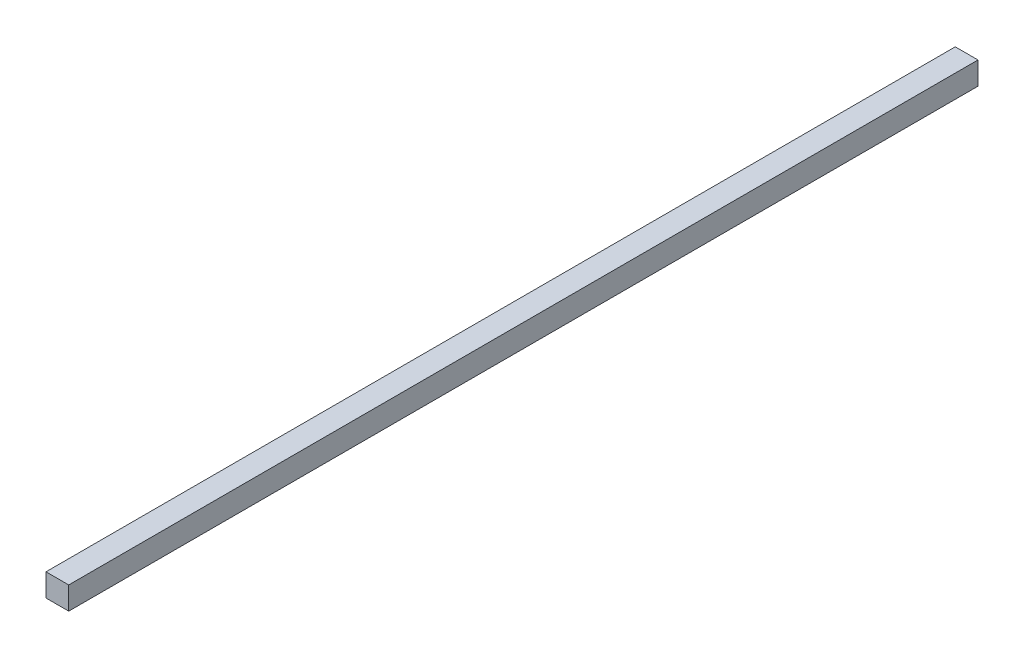
ISO-10303-21;
HEADER;
FILE_DESCRIPTION(('STEP AP214'),'2;1');
FILE_NAME('part.step','',(''),(''),'','','');
FILE_SCHEMA(('AUTOMOTIVE_DESIGN { 1 0 10303 214 1 1 1 1 }'));
ENDSEC;
DATA;
#1=APPLICATION_CONTEXT('core data for automotive mechanical design processes');
#2=APPLICATION_PROTOCOL_DEFINITION('international standard','automotive_design',2000,#1);
#3=PRODUCT_CONTEXT('',#1,'mechanical');
#4=PRODUCT('Part','Part','',(#3));
#5=PRODUCT_RELATED_PRODUCT_CATEGORY('part','',(#4));
#6=PRODUCT_DEFINITION_FORMATION('','',#4);
#7=PRODUCT_DEFINITION_CONTEXT('part definition',#1,'design');
#8=PRODUCT_DEFINITION('design','',#6,#7);
#9=PRODUCT_DEFINITION_SHAPE('','',#8);
#10=(LENGTH_UNIT() NAMED_UNIT(*) SI_UNIT(.MILLI.,.METRE.));
#11=(NAMED_UNIT(*) PLANE_ANGLE_UNIT() SI_UNIT($,.RADIAN.));
#12=(NAMED_UNIT(*) SI_UNIT($,.STERADIAN.) SOLID_ANGLE_UNIT());
#13=UNCERTAINTY_MEASURE_WITH_UNIT(LENGTH_MEASURE(1.E-05),#10,'distance_accuracy_value','');
#14=(GEOMETRIC_REPRESENTATION_CONTEXT(3) GLOBAL_UNCERTAINTY_ASSIGNED_CONTEXT((#13)) GLOBAL_UNIT_ASSIGNED_CONTEXT((#10,
#11,#12)) REPRESENTATION_CONTEXT('',''));
#15=CARTESIAN_POINT('',(0.,0.,0.));
#16=DIRECTION('',(0.,0.,1.));
#17=DIRECTION('',(1.,0.,0.));
#18=AXIS2_PLACEMENT_3D('',#15,#16,#17);
#19=CARTESIAN_POINT('',(0.,0.,2032.));
#20=DIRECTION('',(1.,0.,0.));
#21=DIRECTION('',(0.,0.,-1.));
#22=AXIS2_PLACEMENT_3D('',#19,#20,#21);
#23=PLANE('',#22);
#24=DIRECTION('',(0.,-1.,0.));
#25=VECTOR('',#24,1.);
#26=CARTESIAN_POINT('',(0.,0.,0.));
#27=LINE('',#26,#25);
#28=CARTESIAN_POINT('',(0.,50.8,0.));
#29=VERTEX_POINT('',#28);
#30=CARTESIAN_POINT('',(0.,0.,0.));
#31=VERTEX_POINT('',#30);
#32=EDGE_CURVE('E84',#29,#31,#27,.T.);
#33=ORIENTED_EDGE('',*,*,#32,.T.);
#34=DIRECTION('',(0.,0.,-1.));
#35=VECTOR('',#34,1.);
#36=CARTESIAN_POINT('',(0.,0.,2032.));
#37=LINE('',#36,#35);
#38=CARTESIAN_POINT('',(0.,0.,2032.));
#39=VERTEX_POINT('',#38);
#40=EDGE_CURVE('E11',#39,#31,#37,.T.);
#41=ORIENTED_EDGE('',*,*,#40,.F.);
#42=DIRECTION('',(0.,-1.,0.));
#43=VECTOR('',#42,1.);
#44=CARTESIAN_POINT('',(0.,0.,2032.));
#45=LINE('',#44,#43);
#46=CARTESIAN_POINT('',(0.,50.8,2032.));
#47=VERTEX_POINT('',#46);
#48=EDGE_CURVE('E102',#47,#39,#45,.T.);
#49=ORIENTED_EDGE('',*,*,#48,.F.);
#50=DIRECTION('',(0.,0.,-1.));
#51=VECTOR('',#50,1.);
#52=CARTESIAN_POINT('',(0.,50.8,2032.));
#53=LINE('',#52,#51);
#54=EDGE_CURVE('E96',#47,#29,#53,.T.);
#55=ORIENTED_EDGE('',*,*,#54,.T.);
#56=EDGE_LOOP('',(#33,#41,#49,#55));
#57=FACE_BOUND('',#56,.T.);
#58=ADVANCED_FACE('F40',(#57),#23,.F.);
#59=CARTESIAN_POINT('',(0.,0.,2032.));
#60=DIRECTION('',(0.,1.,0.));
#61=DIRECTION('',(0.,0.,1.));
#62=AXIS2_PLACEMENT_3D('',#59,#60,#61);
#63=PLANE('',#62);
#64=DIRECTION('',(1.,0.,0.));
#65=VECTOR('',#64,1.);
#66=CARTESIAN_POINT('',(0.,0.,0.));
#67=LINE('',#66,#65);
#68=CARTESIAN_POINT('',(50.8,0.,0.));
#69=VERTEX_POINT('',#68);
#70=EDGE_CURVE('E80',#31,#69,#67,.T.);
#71=ORIENTED_EDGE('',*,*,#70,.T.);
#72=DIRECTION('',(0.,0.,-1.));
#73=VECTOR('',#72,1.);
#74=CARTESIAN_POINT('',(50.8,0.,2032.));
#75=LINE('',#74,#73);
#76=CARTESIAN_POINT('',(50.8,0.,2032.));
#77=VERTEX_POINT('',#76);
#78=EDGE_CURVE('E47',#77,#69,#75,.T.);
#79=ORIENTED_EDGE('',*,*,#78,.F.);
#80=DIRECTION('',(1.,0.,0.));
#81=VECTOR('',#80,1.);
#82=CARTESIAN_POINT('',(0.,0.,2032.));
#83=LINE('',#82,#81);
#84=EDGE_CURVE('E92',#39,#77,#83,.T.);
#85=ORIENTED_EDGE('',*,*,#84,.F.);
#86=ORIENTED_EDGE('',*,*,#40,.T.);
#87=EDGE_LOOP('',(#71,#79,#85,#86));
#88=FACE_BOUND('',#87,.T.);
#89=ADVANCED_FACE('F91',(#88),#63,.F.);
#90=CARTESIAN_POINT('',(50.8,0.,2032.));
#91=DIRECTION('',(-1.,0.,0.));
#92=DIRECTION('',(0.,0.,1.));
#93=AXIS2_PLACEMENT_3D('',#90,#91,#92);
#94=PLANE('',#93);
#95=DIRECTION('',(0.,1.,0.));
#96=VECTOR('',#95,1.);
#97=CARTESIAN_POINT('',(50.8,0.,0.));
#98=LINE('',#97,#96);
#99=CARTESIAN_POINT('',(50.8,50.8,0.));
#100=VERTEX_POINT('',#99);
#101=EDGE_CURVE('E85',#69,#100,#98,.T.);
#102=ORIENTED_EDGE('',*,*,#101,.T.);
#103=DIRECTION('',(0.,0.,-1.));
#104=VECTOR('',#103,1.);
#105=CARTESIAN_POINT('',(50.8,50.8,2032.));
#106=LINE('',#105,#104);
#107=CARTESIAN_POINT('',(50.8,50.8,2032.));
#108=VERTEX_POINT('',#107);
#109=EDGE_CURVE('E108',#108,#100,#106,.T.);
#110=ORIENTED_EDGE('',*,*,#109,.F.);
#111=DIRECTION('',(0.,1.,0.));
#112=VECTOR('',#111,1.);
#113=CARTESIAN_POINT('',(50.8,0.,2032.));
#114=LINE('',#113,#112);
#115=EDGE_CURVE('E59',#77,#108,#114,.T.);
#116=ORIENTED_EDGE('',*,*,#115,.F.);
#117=ORIENTED_EDGE('',*,*,#78,.T.);
#118=EDGE_LOOP('',(#102,#110,#116,#117));
#119=FACE_BOUND('',#118,.T.);
#120=ADVANCED_FACE('F111',(#119),#94,.F.);
#121=CARTESIAN_POINT('',(0.,50.8,2032.));
#122=DIRECTION('',(0.,-1.,0.));
#123=DIRECTION('',(0.,0.,-1.));
#124=AXIS2_PLACEMENT_3D('',#121,#122,#123);
#125=PLANE('',#124);
#126=DIRECTION('',(-1.,0.,0.));
#127=VECTOR('',#126,1.);
#128=CARTESIAN_POINT('',(0.,50.8,0.));
#129=LINE('',#128,#127);
#130=EDGE_CURVE('E100',#100,#29,#129,.T.);
#131=ORIENTED_EDGE('',*,*,#130,.T.);
#132=ORIENTED_EDGE('',*,*,#54,.F.);
#133=DIRECTION('',(-1.,0.,0.));
#134=VECTOR('',#133,1.);
#135=CARTESIAN_POINT('',(0.,50.8,2032.));
#136=LINE('',#135,#134);
#137=EDGE_CURVE('E54',#108,#47,#136,.T.);
#138=ORIENTED_EDGE('',*,*,#137,.F.);
#139=ORIENTED_EDGE('',*,*,#109,.T.);
#140=EDGE_LOOP('',(#131,#132,#138,#139));
#141=FACE_BOUND('',#140,.T.);
#142=ADVANCED_FACE('F113',(#141),#125,.F.);
#143=CARTESIAN_POINT('',(0.,50.8,2032.));
#144=DIRECTION('',(0.,0.,-1.));
#145=DIRECTION('',(-1.,0.,0.));
#146=AXIS2_PLACEMENT_3D('',#143,#144,#145);
#147=PLANE('',#146);
#148=ORIENTED_EDGE('',*,*,#48,.T.);
#149=ORIENTED_EDGE('',*,*,#84,.T.);
#150=ORIENTED_EDGE('',*,*,#115,.T.);
#151=ORIENTED_EDGE('',*,*,#137,.T.);
#152=EDGE_LOOP('',(#148,#149,#150,#151));
#153=FACE_BOUND('',#152,.T.);
#154=ADVANCED_FACE('F114',(#153),#147,.F.);
#155=CARTESIAN_POINT('',(0.,50.8,0.));
#156=DIRECTION('',(0.,0.,-1.));
#157=DIRECTION('',(-1.,0.,0.));
#158=AXIS2_PLACEMENT_3D('',#155,#156,#157);
#159=PLANE('',#158);
#160=ORIENTED_EDGE('',*,*,#32,.F.);
#161=ORIENTED_EDGE('',*,*,#130,.F.);
#162=ORIENTED_EDGE('',*,*,#101,.F.);
#163=ORIENTED_EDGE('',*,*,#70,.F.);
#164=EDGE_LOOP('',(#160,#161,#162,#163));
#165=FACE_BOUND('',#164,.T.);
#166=ADVANCED_FACE('F81',(#165),#159,.T.);
#167=CLOSED_SHELL('',(#58,#89,#120,#142,#154,#166));
#168=MANIFOLD_SOLID_BREP('B2',#167);
#169=ADVANCED_BREP_SHAPE_REPRESENTATION('',(#18,#168),#14);
#170=SHAPE_DEFINITION_REPRESENTATION(#9,#169);
ENDSEC;
END-ISO-10303-21;
